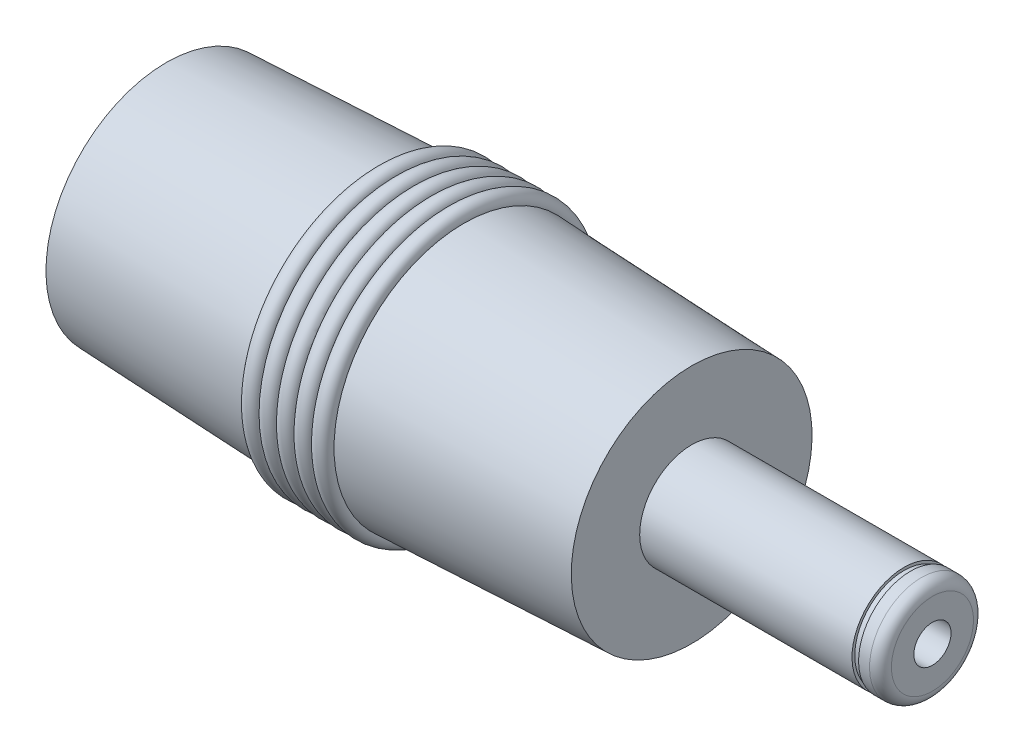
ISO-10303-21;
HEADER;
FILE_DESCRIPTION(('STEP AP214'),'2;1');
FILE_NAME('part.step','',(''),(''),'','','');
FILE_SCHEMA(('AUTOMOTIVE_DESIGN { 1 0 10303 214 1 1 1 1 }'));
ENDSEC;
DATA;
#1=APPLICATION_CONTEXT('core data for automotive mechanical design processes');
#2=APPLICATION_PROTOCOL_DEFINITION('international standard','automotive_design',2000,#1);
#3=PRODUCT_CONTEXT('',#1,'mechanical');
#4=PRODUCT('Part','Part','',(#3));
#5=PRODUCT_RELATED_PRODUCT_CATEGORY('part','',(#4));
#6=PRODUCT_DEFINITION_FORMATION('','',#4);
#7=PRODUCT_DEFINITION_CONTEXT('part definition',#1,'design');
#8=PRODUCT_DEFINITION('design','',#6,#7);
#9=PRODUCT_DEFINITION_SHAPE('','',#8);
#10=(LENGTH_UNIT() NAMED_UNIT(*) SI_UNIT(.MILLI.,.METRE.));
#11=(NAMED_UNIT(*) PLANE_ANGLE_UNIT() SI_UNIT($,.RADIAN.));
#12=(NAMED_UNIT(*) SI_UNIT($,.STERADIAN.) SOLID_ANGLE_UNIT());
#13=UNCERTAINTY_MEASURE_WITH_UNIT(LENGTH_MEASURE(1.E-05),#10,'distance_accuracy_value','');
#14=(GEOMETRIC_REPRESENTATION_CONTEXT(3) GLOBAL_UNCERTAINTY_ASSIGNED_CONTEXT((#13)) GLOBAL_UNIT_ASSIGNED_CONTEXT((#10,
#11,#12)) REPRESENTATION_CONTEXT('',''));
#15=CARTESIAN_POINT('',(0.,0.,0.));
#16=DIRECTION('',(0.,0.,1.));
#17=DIRECTION('',(1.,0.,0.));
#18=AXIS2_PLACEMENT_3D('',#15,#16,#17);
#19=CARTESIAN_POINT('',(28.825,0.,0.));
#20=DIRECTION('',(-1.,0.,0.));
#21=DIRECTION('',(0.,1.,0.));
#22=AXIS2_PLACEMENT_3D('',#19,#20,#21);
#23=CYLINDRICAL_SURFACE('',#22,2.375);
#24=CARTESIAN_POINT('',(24.,0.,0.));
#25=DIRECTION('',(-1.,0.,0.));
#26=DIRECTION('',(0.,1.,0.));
#27=AXIS2_PLACEMENT_3D('',#24,#25,#26);
#28=CIRCLE('',#27,2.375);
#29=CARTESIAN_POINT('',(24.,-2.375,0.));
#30=VERTEX_POINT('',#29);
#31=EDGE_CURVE('E24',#30,#30,#28,.T.);
#32=ORIENTED_EDGE('',*,*,#31,.F.);
#33=EDGE_LOOP('',(#32));
#34=FACE_BOUND('',#33,.T.);
#35=CARTESIAN_POINT('',(33.7,0.,0.));
#36=DIRECTION('',(1.,0.,0.));
#37=DIRECTION('',(0.,1.,0.));
#38=AXIS2_PLACEMENT_3D('',#35,#36,#37);
#39=CIRCLE('',#38,2.375);
#40=CARTESIAN_POINT('',(33.7,2.375,0.));
#41=VERTEX_POINT('',#40);
#42=EDGE_CURVE('E11',#41,#41,#39,.T.);
#43=ORIENTED_EDGE('',*,*,#42,.F.);
#44=EDGE_LOOP('',(#43));
#45=FACE_BOUND('',#44,.T.);
#46=ADVANCED_FACE('F17',(#34,#45),#23,.T.);
#47=CARTESIAN_POINT('',(33.7,2.3125,0.));
#48=DIRECTION('',(1.,0.,0.));
#49=DIRECTION('',(0.,1.,0.));
#50=AXIS2_PLACEMENT_3D('',#47,#48,#49);
#51=PLANE('',#50);
#52=ORIENTED_EDGE('',*,*,#42,.T.);
#53=EDGE_LOOP('',(#52));
#54=FACE_BOUND('',#53,.T.);
#55=CARTESIAN_POINT('',(33.7,0.,0.));
#56=DIRECTION('',(1.,0.,0.));
#57=DIRECTION('',(0.,1.,0.));
#58=AXIS2_PLACEMENT_3D('',#55,#56,#57);
#59=CIRCLE('',#58,2.25);
#60=CARTESIAN_POINT('',(33.7,2.25,0.));
#61=VERTEX_POINT('',#60);
#62=EDGE_CURVE('E176',#61,#61,#59,.T.);
#63=ORIENTED_EDGE('',*,*,#62,.F.);
#64=EDGE_LOOP('',(#63));
#65=FACE_BOUND('',#64,.T.);
#66=ADVANCED_FACE('F184',(#54,#65),#51,.T.);
#67=CARTESIAN_POINT('',(24.,2.75,0.));
#68=DIRECTION('',(1.,0.,0.));
#69=DIRECTION('',(0.,1.,0.));
#70=AXIS2_PLACEMENT_3D('',#67,#68,#69);
#71=PLANE('',#70);
#72=CARTESIAN_POINT('',(24.,0.,0.));
#73=DIRECTION('',(1.,0.,0.));
#74=DIRECTION('',(0.,1.,0.));
#75=AXIS2_PLACEMENT_3D('',#72,#73,#74);
#76=CIRCLE('',#75,5.5);
#77=CARTESIAN_POINT('',(24.,5.5,0.));
#78=VERTEX_POINT('',#77);
#79=EDGE_CURVE('E180',#78,#78,#76,.T.);
#80=ORIENTED_EDGE('',*,*,#79,.T.);
#81=EDGE_LOOP('',(#80));
#82=FACE_BOUND('',#81,.T.);
#83=ORIENTED_EDGE('',*,*,#31,.T.);
#84=EDGE_LOOP('',(#83));
#85=FACE_BOUND('',#84,.T.);
#86=ADVANCED_FACE('F190',(#82,#85),#71,.T.);
#87=CARTESIAN_POINT('',(33.875,0.,0.));
#88=DIRECTION('',(-1.,0.,0.));
#89=DIRECTION('',(0.,1.,0.));
#90=AXIS2_PLACEMENT_3D('',#87,#88,#89);
#91=CYLINDRICAL_SURFACE('',#90,2.25);
#92=ORIENTED_EDGE('',*,*,#62,.T.);
#93=EDGE_LOOP('',(#92));
#94=FACE_BOUND('',#93,.T.);
#95=CARTESIAN_POINT('',(34.,0.,0.));
#96=DIRECTION('',(-1.,0.,0.));
#97=DIRECTION('',(0.,1.,0.));
#98=AXIS2_PLACEMENT_3D('',#95,#96,#97);
#99=CIRCLE('',#98,2.25);
#100=CARTESIAN_POINT('',(34.,-2.25,0.));
#101=VERTEX_POINT('',#100);
#102=EDGE_CURVE('E175',#101,#101,#99,.T.);
#103=ORIENTED_EDGE('',*,*,#102,.T.);
#104=EDGE_LOOP('',(#103));
#105=FACE_BOUND('',#104,.T.);
#106=ADVANCED_FACE('F181',(#94,#105),#91,.T.);
#107=CARTESIAN_POINT('',(18.,0.,0.));
#108=DIRECTION('',(-1.,0.,0.));
#109=DIRECTION('',(0.,1.,0.));
#110=AXIS2_PLACEMENT_3D('',#107,#108,#109);
#111=CONICAL_SURFACE('',#110,5.75,0.0416425790985869);
#112=ORIENTED_EDGE('',*,*,#79,.F.);
#113=EDGE_LOOP('',(#112));
#114=FACE_BOUND('',#113,.T.);
#115=CARTESIAN_POINT('',(13.5944443769948,0.,0.));
#116=DIRECTION('',(1.,0.,0.));
#117=DIRECTION('',(0.,1.,0.));
#118=AXIS2_PLACEMENT_3D('',#115,#116,#117);
#119=CIRCLE('',#118,5.93356481762522);
#120=CARTESIAN_POINT('',(13.5944443769948,-5.93356481762522,0.));
#121=VERTEX_POINT('',#120);
#122=EDGE_CURVE('E158',#121,#121,#119,.T.);
#123=ORIENTED_EDGE('',*,*,#122,.T.);
#124=EDGE_LOOP('',(#123));
#125=FACE_BOUND('',#124,.T.);
#126=ADVANCED_FACE('F200',(#114,#125),#111,.T.);
#127=CARTESIAN_POINT('',(34.,1.1875,0.));
#128=DIRECTION('',(-1.,0.,0.));
#129=DIRECTION('',(0.,-1.,0.));
#130=AXIS2_PLACEMENT_3D('',#127,#128,#129);
#131=PLANE('',#130);
#132=ORIENTED_EDGE('',*,*,#102,.F.);
#133=EDGE_LOOP('',(#132));
#134=FACE_BOUND('',#133,.T.);
#135=CARTESIAN_POINT('',(34.,0.,0.));
#136=DIRECTION('',(1.,0.,0.));
#137=DIRECTION('',(0.,1.,0.));
#138=AXIS2_PLACEMENT_3D('',#135,#136,#137);
#139=CIRCLE('',#138,2.375);
#140=CARTESIAN_POINT('',(34.,2.375,0.));
#141=VERTEX_POINT('',#140);
#142=EDGE_CURVE('E156',#141,#141,#139,.T.);
#143=ORIENTED_EDGE('',*,*,#142,.F.);
#144=EDGE_LOOP('',(#143));
#145=FACE_BOUND('',#144,.T.);
#146=ADVANCED_FACE('F205',(#134,#145),#131,.T.);
#147=CARTESIAN_POINT('',(13.2,0.,0.));
#148=DIRECTION('',(1.,0.,0.));
#149=DIRECTION('',(0.,0.,-1.));
#150=AXIS2_PLACEMENT_3D('',#147,#148,#149);
#151=TOROIDAL_SURFACE('',#150,6.,0.4);
#152=ORIENTED_EDGE('',*,*,#122,.F.);
#153=EDGE_LOOP('',(#152));
#154=FACE_BOUND('',#153,.T.);
#155=CARTESIAN_POINT('',(12.8,0.,0.));
#156=DIRECTION('',(1.,0.,0.));
#157=DIRECTION('',(0.,0.,-1.));
#158=AXIS2_PLACEMENT_3D('',#155,#156,#157);
#159=CIRCLE('',#158,6.);
#160=CARTESIAN_POINT('',(12.8,0.,6.));
#161=VERTEX_POINT('',#160);
#162=EDGE_CURVE('E133',#161,#161,#159,.T.);
#163=ORIENTED_EDGE('',*,*,#162,.T.);
#164=EDGE_LOOP('',(#163));
#165=FACE_BOUND('',#164,.T.);
#166=ADVANCED_FACE('F204',(#154,#165),#151,.T.);
#167=CARTESIAN_POINT('',(34.25,0.,0.));
#168=DIRECTION('',(-1.,0.,0.));
#169=DIRECTION('',(0.,1.,0.));
#170=AXIS2_PLACEMENT_3D('',#167,#168,#169);
#171=CYLINDRICAL_SURFACE('',#170,2.375);
#172=ORIENTED_EDGE('',*,*,#142,.T.);
#173=EDGE_LOOP('',(#172));
#174=FACE_BOUND('',#173,.T.);
#175=CARTESIAN_POINT('',(34.5,0.,0.));
#176=DIRECTION('',(1.,0.,0.));
#177=DIRECTION('',(0.,1.,0.));
#178=AXIS2_PLACEMENT_3D('',#175,#176,#177);
#179=CIRCLE('',#178,2.375);
#180=CARTESIAN_POINT('',(34.5,2.375,0.));
#181=VERTEX_POINT('',#180);
#182=EDGE_CURVE('E135',#181,#181,#179,.T.);
#183=ORIENTED_EDGE('',*,*,#182,.F.);
#184=EDGE_LOOP('',(#183));
#185=FACE_BOUND('',#184,.T.);
#186=ADVANCED_FACE('F210',(#174,#185),#171,.T.);
#187=CARTESIAN_POINT('',(13.2,0.,0.));
#188=DIRECTION('',(1.,0.,0.));
#189=DIRECTION('',(0.,0.,-1.));
#190=AXIS2_PLACEMENT_3D('',#187,#188,#189);
#191=TOROIDAL_SURFACE('',#190,6.,0.4);
#192=ORIENTED_EDGE('',*,*,#162,.F.);
#193=EDGE_LOOP('',(#192));
#194=FACE_BOUND('',#193,.T.);
#195=CARTESIAN_POINT('',(12.8013961775979,0.,0.));
#196=DIRECTION('',(-1.,0.,0.));
#197=DIRECTION('',(0.,1.,0.));
#198=AXIS2_PLACEMENT_3D('',#195,#196,#197);
#199=CIRCLE('',#198,5.96660849260009);
#200=CARTESIAN_POINT('',(12.8013961775979,-5.96660849260009,0.));
#201=VERTEX_POINT('',#200);
#202=EDGE_CURVE('E134',#201,#201,#199,.T.);
#203=ORIENTED_EDGE('',*,*,#202,.F.);
#204=EDGE_LOOP('',(#203));
#205=FACE_BOUND('',#204,.T.);
#206=ADVANCED_FACE('F207',(#194,#205),#191,.T.);
#207=CARTESIAN_POINT('',(34.5,0.,0.));
#208=DIRECTION('',(1.,0.,0.));
#209=DIRECTION('',(0.,0.,-1.));
#210=AXIS2_PLACEMENT_3D('',#207,#208,#209);
#211=TOROIDAL_SURFACE('',#210,1.875,0.5);
#212=ORIENTED_EDGE('',*,*,#182,.T.);
#213=EDGE_LOOP('',(#212));
#214=FACE_BOUND('',#213,.T.);
#215=CARTESIAN_POINT('',(35.,0.,0.));
#216=DIRECTION('',(1.,0.,0.));
#217=DIRECTION('',(0.,1.,0.));
#218=AXIS2_PLACEMENT_3D('',#215,#216,#217);
#219=CIRCLE('',#218,1.875);
#220=CARTESIAN_POINT('',(35.,1.875,0.));
#221=VERTEX_POINT('',#220);
#222=EDGE_CURVE('E168',#221,#221,#219,.T.);
#223=ORIENTED_EDGE('',*,*,#222,.F.);
#224=EDGE_LOOP('',(#223));
#225=FACE_BOUND('',#224,.T.);
#226=ADVANCED_FACE('F215',(#214,#225),#211,.T.);
#227=CARTESIAN_POINT('',(18.,0.,0.));
#228=DIRECTION('',(-1.,0.,0.));
#229=DIRECTION('',(0.,1.,0.));
#230=AXIS2_PLACEMENT_3D('',#227,#228,#229);
#231=CONICAL_SURFACE('',#230,5.75,0.0416425790985869);
#232=CARTESIAN_POINT('',(12.7986135181976,0.,0.));
#233=DIRECTION('',(1.,0.,0.));
#234=DIRECTION('',(0.,1.,0.));
#235=AXIS2_PLACEMENT_3D('',#232,#233,#234);
#236=CIRCLE('',#235,5.96672443674177);
#237=CARTESIAN_POINT('',(12.7986135181976,-5.96672443674177,0.));
#238=VERTEX_POINT('',#237);
#239=EDGE_CURVE('E169',#238,#238,#236,.T.);
#240=ORIENTED_EDGE('',*,*,#239,.T.);
#241=EDGE_LOOP('',(#240));
#242=FACE_BOUND('',#241,.T.);
#243=ORIENTED_EDGE('',*,*,#202,.T.);
#244=EDGE_LOOP('',(#243));
#245=FACE_BOUND('',#244,.T.);
#246=ADVANCED_FACE('F216',(#242,#245),#231,.T.);
#247=CARTESIAN_POINT('',(35.,0.9375,0.));
#248=DIRECTION('',(1.,0.,0.));
#249=DIRECTION('',(0.,1.,0.));
#250=AXIS2_PLACEMENT_3D('',#247,#248,#249);
#251=PLANE('',#250);
#252=ORIENTED_EDGE('',*,*,#222,.T.);
#253=EDGE_LOOP('',(#252));
#254=FACE_BOUND('',#253,.T.);
#255=CARTESIAN_POINT('',(35.,0.,0.));
#256=DIRECTION('',(-1.,0.,0.));
#257=DIRECTION('',(0.,0.,-1.));
#258=AXIS2_PLACEMENT_3D('',#255,#256,#257);
#259=CIRCLE('',#258,0.85);
#260=CARTESIAN_POINT('',(35.,0.,0.85));
#261=VERTEX_POINT('',#260);
#262=EDGE_CURVE('E167',#261,#261,#259,.T.);
#263=ORIENTED_EDGE('',*,*,#262,.T.);
#264=EDGE_LOOP('',(#263));
#265=FACE_BOUND('',#264,.T.);
#266=ADVANCED_FACE('F219',(#254,#265),#251,.T.);
#267=CARTESIAN_POINT('',(12.4,0.,0.));
#268=DIRECTION('',(1.,0.,0.));
#269=DIRECTION('',(0.,0.,-1.));
#270=AXIS2_PLACEMENT_3D('',#267,#268,#269);
#271=TOROIDAL_SURFACE('',#270,6.,0.4);
#272=ORIENTED_EDGE('',*,*,#239,.F.);
#273=EDGE_LOOP('',(#272));
#274=FACE_BOUND('',#273,.T.);
#275=CARTESIAN_POINT('',(12.8,0.,0.));
#276=DIRECTION('',(1.,0.,0.));
#277=DIRECTION('',(0.,0.,-1.));
#278=AXIS2_PLACEMENT_3D('',#275,#276,#277);
#279=CIRCLE('',#278,6.);
#280=CARTESIAN_POINT('',(12.8,0.,6.));
#281=VERTEX_POINT('',#280);
#282=EDGE_CURVE('E163',#281,#281,#279,.T.);
#283=ORIENTED_EDGE('',*,*,#282,.T.);
#284=EDGE_LOOP('',(#283));
#285=FACE_BOUND('',#284,.T.);
#286=ADVANCED_FACE('F225',(#274,#285),#271,.T.);
#287=CARTESIAN_POINT('',(30.,0.,0.));
#288=DIRECTION('',(-1.,0.,0.));
#289=DIRECTION('',(0.,0.,-1.));
#290=AXIS2_PLACEMENT_3D('',#287,#288,#289);
#291=CYLINDRICAL_SURFACE('',#290,0.85);
#292=CARTESIAN_POINT('',(24.,0.,0.));
#293=DIRECTION('',(1.,0.,0.));
#294=DIRECTION('',(0.,0.,-1.));
#295=AXIS2_PLACEMENT_3D('',#292,#293,#294);
#296=CIRCLE('',#295,0.85);
#297=CARTESIAN_POINT('',(24.,0.,-0.85));
#298=VERTEX_POINT('',#297);
#299=EDGE_CURVE('E129',#298,#298,#296,.T.);
#300=ORIENTED_EDGE('',*,*,#299,.F.);
#301=EDGE_LOOP('',(#300));
#302=FACE_BOUND('',#301,.T.);
#303=ORIENTED_EDGE('',*,*,#262,.F.);
#304=EDGE_LOOP('',(#303));
#305=FACE_BOUND('',#304,.T.);
#306=ADVANCED_FACE('F223',(#302,#305),#291,.F.);
#307=CARTESIAN_POINT('',(12.4,0.,0.));
#308=DIRECTION('',(1.,0.,0.));
#309=DIRECTION('',(0.,0.,-1.));
#310=AXIS2_PLACEMENT_3D('',#307,#308,#309);
#311=TOROIDAL_SURFACE('',#310,6.,0.4);
#312=ORIENTED_EDGE('',*,*,#282,.F.);
#313=EDGE_LOOP('',(#312));
#314=FACE_BOUND('',#313,.T.);
#315=CARTESIAN_POINT('',(12.,0.,0.));
#316=DIRECTION('',(1.,0.,0.));
#317=DIRECTION('',(0.,1.,0.));
#318=AXIS2_PLACEMENT_3D('',#315,#316,#317);
#319=CIRCLE('',#318,6.);
#320=CARTESIAN_POINT('',(12.,6.,0.));
#321=VERTEX_POINT('',#320);
#322=EDGE_CURVE('E128',#321,#321,#319,.T.);
#323=ORIENTED_EDGE('',*,*,#322,.T.);
#324=EDGE_LOOP('',(#323));
#325=FACE_BOUND('',#324,.T.);
#326=ADVANCED_FACE('F228',(#314,#325),#311,.T.);
#327=CARTESIAN_POINT('',(24.,2.75,0.));
#328=DIRECTION('',(1.,0.,0.));
#329=DIRECTION('',(0.,1.,0.));
#330=AXIS2_PLACEMENT_3D('',#327,#328,#329);
#331=PLANE('',#330);
#332=ORIENTED_EDGE('',*,*,#299,.T.);
#333=EDGE_LOOP('',(#332));
#334=FACE_BOUND('',#333,.T.);
#335=ADVANCED_FACE('F234',(#334),#331,.T.);
#336=CARTESIAN_POINT('',(11.6,0.,0.));
#337=DIRECTION('',(1.,0.,0.));
#338=DIRECTION('',(0.,0.,-1.));
#339=AXIS2_PLACEMENT_3D('',#336,#337,#338);
#340=TOROIDAL_SURFACE('',#339,6.,0.4);
#341=ORIENTED_EDGE('',*,*,#322,.F.);
#342=EDGE_LOOP('',(#341));
#343=FACE_BOUND('',#342,.T.);
#344=CARTESIAN_POINT('',(11.2,0.,0.));
#345=DIRECTION('',(1.,0.,0.));
#346=DIRECTION('',(0.,0.,-1.));
#347=AXIS2_PLACEMENT_3D('',#344,#345,#346);
#348=CIRCLE('',#347,6.);
#349=CARTESIAN_POINT('',(11.2,0.,6.));
#350=VERTEX_POINT('',#349);
#351=EDGE_CURVE('E131',#350,#350,#348,.T.);
#352=ORIENTED_EDGE('',*,*,#351,.T.);
#353=EDGE_LOOP('',(#352));
#354=FACE_BOUND('',#353,.T.);
#355=ADVANCED_FACE('F236',(#343,#354),#340,.T.);
#356=CARTESIAN_POINT('',(11.6,0.,0.));
#357=DIRECTION('',(1.,0.,0.));
#358=DIRECTION('',(0.,0.,-1.));
#359=AXIS2_PLACEMENT_3D('',#356,#357,#358);
#360=TOROIDAL_SURFACE('',#359,6.,0.4);
#361=ORIENTED_EDGE('',*,*,#351,.F.);
#362=EDGE_LOOP('',(#361));
#363=FACE_BOUND('',#362,.T.);
#364=CARTESIAN_POINT('',(11.2013864818024,0.,0.));
#365=DIRECTION('',(-1.,0.,0.));
#366=DIRECTION('',(0.,1.,0.));
#367=AXIS2_PLACEMENT_3D('',#364,#365,#366);
#368=CIRCLE('',#367,5.96672443674177);
#369=CARTESIAN_POINT('',(11.2013864818024,-5.96672443674177,0.));
#370=VERTEX_POINT('',#369);
#371=EDGE_CURVE('E145',#370,#370,#368,.T.);
#372=ORIENTED_EDGE('',*,*,#371,.F.);
#373=EDGE_LOOP('',(#372));
#374=FACE_BOUND('',#373,.T.);
#375=ADVANCED_FACE('F237',(#363,#374),#360,.T.);
#376=CARTESIAN_POINT('',(6.,0.,0.));
#377=DIRECTION('',(1.,0.,0.));
#378=DIRECTION('',(0.,1.,0.));
#379=AXIS2_PLACEMENT_3D('',#376,#377,#378);
#380=CONICAL_SURFACE('',#379,5.75,0.0416425790985869);
#381=CARTESIAN_POINT('',(11.1986038224021,0.,0.));
#382=DIRECTION('',(1.,0.,0.));
#383=DIRECTION('',(0.,1.,0.));
#384=AXIS2_PLACEMENT_3D('',#381,#382,#383);
#385=CIRCLE('',#384,5.96660849260009);
#386=CARTESIAN_POINT('',(11.1986038224021,-5.96660849260009,0.));
#387=VERTEX_POINT('',#386);
#388=EDGE_CURVE('E142',#387,#387,#385,.T.);
#389=ORIENTED_EDGE('',*,*,#388,.T.);
#390=EDGE_LOOP('',(#389));
#391=FACE_BOUND('',#390,.T.);
#392=ORIENTED_EDGE('',*,*,#371,.T.);
#393=EDGE_LOOP('',(#392));
#394=FACE_BOUND('',#393,.T.);
#395=ADVANCED_FACE('F245',(#391,#394),#380,.T.);
#396=CARTESIAN_POINT('',(10.8,0.,0.));
#397=DIRECTION('',(1.,0.,0.));
#398=DIRECTION('',(0.,0.,-1.));
#399=AXIS2_PLACEMENT_3D('',#396,#397,#398);
#400=TOROIDAL_SURFACE('',#399,6.,0.4);
#401=ORIENTED_EDGE('',*,*,#388,.F.);
#402=EDGE_LOOP('',(#401));
#403=FACE_BOUND('',#402,.T.);
#404=CARTESIAN_POINT('',(11.2,0.,0.));
#405=DIRECTION('',(1.,0.,0.));
#406=DIRECTION('',(0.,0.,-1.));
#407=AXIS2_PLACEMENT_3D('',#404,#405,#406);
#408=CIRCLE('',#407,6.);
#409=CARTESIAN_POINT('',(11.2,0.,6.));
#410=VERTEX_POINT('',#409);
#411=EDGE_CURVE('E144',#410,#410,#408,.T.);
#412=ORIENTED_EDGE('',*,*,#411,.T.);
#413=EDGE_LOOP('',(#412));
#414=FACE_BOUND('',#413,.T.);
#415=ADVANCED_FACE('F249',(#403,#414),#400,.T.);
#416=CARTESIAN_POINT('',(10.8,0.,0.));
#417=DIRECTION('',(1.,0.,0.));
#418=DIRECTION('',(0.,0.,-1.));
#419=AXIS2_PLACEMENT_3D('',#416,#417,#418);
#420=TOROIDAL_SURFACE('',#419,6.,0.4);
#421=ORIENTED_EDGE('',*,*,#411,.F.);
#422=EDGE_LOOP('',(#421));
#423=FACE_BOUND('',#422,.T.);
#424=CARTESIAN_POINT('',(10.4,0.,0.));
#425=DIRECTION('',(1.,0.,0.));
#426=DIRECTION('',(0.,0.,-1.));
#427=AXIS2_PLACEMENT_3D('',#424,#425,#426);
#428=CIRCLE('',#427,6.);
#429=CARTESIAN_POINT('',(10.4,0.,6.));
#430=VERTEX_POINT('',#429);
#431=EDGE_CURVE('E147',#430,#430,#428,.T.);
#432=ORIENTED_EDGE('',*,*,#431,.T.);
#433=EDGE_LOOP('',(#432));
#434=FACE_BOUND('',#433,.T.);
#435=ADVANCED_FACE('F243',(#423,#434),#420,.T.);
#436=CARTESIAN_POINT('',(10.8,0.,0.));
#437=DIRECTION('',(1.,0.,0.));
#438=DIRECTION('',(0.,0.,-1.));
#439=AXIS2_PLACEMENT_3D('',#436,#437,#438);
#440=TOROIDAL_SURFACE('',#439,6.,0.4);
#441=ORIENTED_EDGE('',*,*,#431,.F.);
#442=EDGE_LOOP('',(#441));
#443=FACE_BOUND('',#442,.T.);
#444=CARTESIAN_POINT('',(10.4055556230052,0.,0.));
#445=DIRECTION('',(-1.,0.,0.));
#446=DIRECTION('',(0.,1.,0.));
#447=AXIS2_PLACEMENT_3D('',#444,#445,#446);
#448=CIRCLE('',#447,5.93356481762522);
#449=CARTESIAN_POINT('',(10.4055556230052,-5.93356481762522,0.));
#450=VERTEX_POINT('',#449);
#451=EDGE_CURVE('E146',#450,#450,#448,.T.);
#452=ORIENTED_EDGE('',*,*,#451,.F.);
#453=EDGE_LOOP('',(#452));
#454=FACE_BOUND('',#453,.T.);
#455=ADVANCED_FACE('F250',(#443,#454),#440,.T.);
#456=CARTESIAN_POINT('',(6.,0.,0.));
#457=DIRECTION('',(1.,0.,0.));
#458=DIRECTION('',(0.,1.,0.));
#459=AXIS2_PLACEMENT_3D('',#456,#457,#458);
#460=CONICAL_SURFACE('',#459,5.75,0.0416425790985869);
#461=CARTESIAN_POINT('',(10.3943655639339,0.,0.));
#462=DIRECTION('',(1.,0.,0.));
#463=DIRECTION('',(0.,1.,0.));
#464=AXIS2_PLACEMENT_3D('',#461,#462,#463);
#465=CIRCLE('',#464,5.93309856516391);
#466=CARTESIAN_POINT('',(10.3943655639339,-5.93309856516391,0.));
#467=VERTEX_POINT('',#466);
#468=EDGE_CURVE('E151',#467,#467,#465,.T.);
#469=ORIENTED_EDGE('',*,*,#468,.T.);
#470=EDGE_LOOP('',(#469));
#471=FACE_BOUND('',#470,.T.);
#472=ORIENTED_EDGE('',*,*,#451,.T.);
#473=EDGE_LOOP('',(#472));
#474=FACE_BOUND('',#473,.T.);
#475=ADVANCED_FACE('F248',(#471,#474),#460,.T.);
#476=CARTESIAN_POINT('',(10.,0.,0.));
#477=DIRECTION('',(1.,0.,0.));
#478=DIRECTION('',(0.,0.,-1.));
#479=AXIS2_PLACEMENT_3D('',#476,#477,#478);
#480=TOROIDAL_SURFACE('',#479,6.,0.4);
#481=ORIENTED_EDGE('',*,*,#468,.F.);
#482=EDGE_LOOP('',(#481));
#483=FACE_BOUND('',#482,.T.);
#484=CARTESIAN_POINT('',(10.4,0.,0.));
#485=DIRECTION('',(1.,0.,0.));
#486=DIRECTION('',(0.,0.,-1.));
#487=AXIS2_PLACEMENT_3D('',#484,#485,#486);
#488=CIRCLE('',#487,6.);
#489=CARTESIAN_POINT('',(10.4,0.,6.));
#490=VERTEX_POINT('',#489);
#491=EDGE_CURVE('E153',#490,#490,#488,.T.);
#492=ORIENTED_EDGE('',*,*,#491,.T.);
#493=EDGE_LOOP('',(#492));
#494=FACE_BOUND('',#493,.T.);
#495=ADVANCED_FACE('F251',(#483,#494),#480,.T.);
#496=CARTESIAN_POINT('',(10.,0.,0.));
#497=DIRECTION('',(1.,0.,0.));
#498=DIRECTION('',(0.,0.,-1.));
#499=AXIS2_PLACEMENT_3D('',#496,#497,#498);
#500=TOROIDAL_SURFACE('',#499,6.,0.4);
#501=ORIENTED_EDGE('',*,*,#491,.F.);
#502=EDGE_LOOP('',(#501));
#503=FACE_BOUND('',#502,.T.);
#504=CARTESIAN_POINT('',(9.61256684507827,0.,0.));
#505=DIRECTION('',(-1.,0.,0.));
#506=DIRECTION('',(0.,1.,0.));
#507=AXIS2_PLACEMENT_3D('',#504,#505,#506);
#508=CIRCLE('',#507,5.90052361854493);
#509=CARTESIAN_POINT('',(9.61256684507827,-5.90052361854493,0.));
#510=VERTEX_POINT('',#509);
#511=EDGE_CURVE('E150',#510,#510,#508,.T.);
#512=ORIENTED_EDGE('',*,*,#511,.F.);
#513=EDGE_LOOP('',(#512));
#514=FACE_BOUND('',#513,.T.);
#515=ADVANCED_FACE('F260',(#503,#514),#500,.T.);
#516=CARTESIAN_POINT('',(6.,0.,0.));
#517=DIRECTION('',(1.,0.,0.));
#518=DIRECTION('',(0.,1.,0.));
#519=AXIS2_PLACEMENT_3D('',#516,#517,#518);
#520=CONICAL_SURFACE('',#519,5.75,0.0416425790985869);
#521=CARTESIAN_POINT('',(0.,0.,0.));
#522=DIRECTION('',(1.,0.,0.));
#523=DIRECTION('',(0.,1.,0.));
#524=AXIS2_PLACEMENT_3D('',#521,#522,#523);
#525=CIRCLE('',#524,5.5);
#526=CARTESIAN_POINT('',(0.,5.5,0.));
#527=VERTEX_POINT('',#526);
#528=EDGE_CURVE('E143',#527,#527,#525,.T.);
#529=ORIENTED_EDGE('',*,*,#528,.T.);
#530=EDGE_LOOP('',(#529));
#531=FACE_BOUND('',#530,.T.);
#532=ORIENTED_EDGE('',*,*,#511,.T.);
#533=EDGE_LOOP('',(#532));
#534=FACE_BOUND('',#533,.T.);
#535=ADVANCED_FACE('F265',(#531,#534),#520,.T.);
#536=CARTESIAN_POINT('',(0.,2.75,0.));
#537=DIRECTION('',(-1.,0.,0.));
#538=DIRECTION('',(0.,-1.,0.));
#539=AXIS2_PLACEMENT_3D('',#536,#537,#538);
#540=PLANE('',#539);
#541=ORIENTED_EDGE('',*,*,#528,.F.);
#542=EDGE_LOOP('',(#541));
#543=FACE_BOUND('',#542,.T.);
#544=CARTESIAN_POINT('',(0.,0.,0.));
#545=DIRECTION('',(1.,0.,0.));
#546=DIRECTION('',(0.,0.,1.));
#547=AXIS2_PLACEMENT_3D('',#544,#545,#546);
#548=CIRCLE('',#547,3.25);
#549=CARTESIAN_POINT('',(0.,0.,-3.25));
#550=VERTEX_POINT('',#549);
#551=EDGE_CURVE('E136',#550,#550,#548,.T.);
#552=ORIENTED_EDGE('',*,*,#551,.T.);
#553=EDGE_LOOP('',(#552));
#554=FACE_BOUND('',#553,.T.);
#555=ADVANCED_FACE('F264',(#543,#554),#540,.T.);
#556=CARTESIAN_POINT('',(0.,0.,0.));
#557=DIRECTION('',(1.,0.,0.));
#558=DIRECTION('',(0.,0.,-1.));
#559=AXIS2_PLACEMENT_3D('',#556,#557,#558);
#560=TOROIDAL_SURFACE('',#559,3.,0.25);
#561=ORIENTED_EDGE('',*,*,#551,.F.);
#562=EDGE_LOOP('',(#561));
#563=FACE_BOUND('',#562,.T.);
#564=CARTESIAN_POINT('',(0.,0.,0.));
#565=DIRECTION('',(1.,0.,0.));
#566=DIRECTION('',(0.,0.,-1.));
#567=AXIS2_PLACEMENT_3D('',#564,#565,#566);
#568=CIRCLE('',#567,2.75);
#569=CARTESIAN_POINT('',(0.,0.,2.75));
#570=VERTEX_POINT('',#569);
#571=EDGE_CURVE('E140',#570,#570,#568,.T.);
#572=ORIENTED_EDGE('',*,*,#571,.T.);
#573=EDGE_LOOP('',(#572));
#574=FACE_BOUND('',#573,.T.);
#575=ADVANCED_FACE('F275',(#563,#574),#560,.T.);
#576=CARTESIAN_POINT('',(5.,0.,0.));
#577=DIRECTION('',(-1.,0.,0.));
#578=DIRECTION('',(0.,0.,-1.));
#579=AXIS2_PLACEMENT_3D('',#576,#577,#578);
#580=CYLINDRICAL_SURFACE('',#579,2.75);
#581=CARTESIAN_POINT('',(11.,0.,0.));
#582=DIRECTION('',(1.,0.,0.));
#583=DIRECTION('',(0.,0.,-1.));
#584=AXIS2_PLACEMENT_3D('',#581,#582,#583);
#585=CIRCLE('',#584,2.75);
#586=CARTESIAN_POINT('',(11.,0.,-2.75));
#587=VERTEX_POINT('',#586);
#588=EDGE_CURVE('E123',#587,#587,#585,.T.);
#589=ORIENTED_EDGE('',*,*,#588,.T.);
#590=EDGE_LOOP('',(#589));
#591=FACE_BOUND('',#590,.T.);
#592=ORIENTED_EDGE('',*,*,#571,.F.);
#593=EDGE_LOOP('',(#592));
#594=FACE_BOUND('',#593,.T.);
#595=ADVANCED_FACE('F276',(#591,#594),#580,.F.);
#596=CARTESIAN_POINT('',(11.,0.,0.));
#597=DIRECTION('',(1.,0.,0.));
#598=DIRECTION('',(0.,0.,-1.));
#599=AXIS2_PLACEMENT_3D('',#596,#597,#598);
#600=PLANE('',#599);
#601=ORIENTED_EDGE('',*,*,#588,.F.);
#602=EDGE_LOOP('',(#601));
#603=FACE_BOUND('',#602,.T.);
#604=CARTESIAN_POINT('',(11.,0.,0.));
#605=DIRECTION('',(1.,0.,0.));
#606=DIRECTION('',(0.,0.,-1.));
#607=AXIS2_PLACEMENT_3D('',#604,#605,#606);
#608=CIRCLE('',#607,1.05);
#609=CARTESIAN_POINT('',(11.,0.,1.05));
#610=VERTEX_POINT('',#609);
#611=EDGE_CURVE('E124',#610,#610,#608,.T.);
#612=ORIENTED_EDGE('',*,*,#611,.T.);
#613=EDGE_LOOP('',(#612));
#614=FACE_BOUND('',#613,.T.);
#615=ADVANCED_FACE('F286',(#603,#614),#600,.F.);
#616=CARTESIAN_POINT('',(6.275,0.,0.));
#617=DIRECTION('',(-1.,0.,0.));
#618=DIRECTION('',(0.,0.,-1.));
#619=AXIS2_PLACEMENT_3D('',#616,#617,#618);
#620=CYLINDRICAL_SURFACE('',#619,1.05);
#621=ORIENTED_EDGE('',*,*,#611,.F.);
#622=EDGE_LOOP('',(#621));
#623=FACE_BOUND('',#622,.T.);
#624=CARTESIAN_POINT('',(1.05,0.,0.));
#625=DIRECTION('',(-1.,0.,0.));
#626=DIRECTION('',(0.,0.,-1.));
#627=AXIS2_PLACEMENT_3D('',#624,#625,#626);
#628=CIRCLE('',#627,1.05);
#629=CARTESIAN_POINT('',(1.05,0.,-1.05));
#630=VERTEX_POINT('',#629);
#631=EDGE_CURVE('E120',#630,#630,#628,.T.);
#632=ORIENTED_EDGE('',*,*,#631,.F.);
#633=EDGE_LOOP('',(#632));
#634=FACE_BOUND('',#633,.T.);
#635=ADVANCED_FACE('F293',(#623,#634),#620,.T.);
#636=CARTESIAN_POINT('',(1.05,0.,0.));
#637=DIRECTION('',(0.,0.,1.));
#638=DIRECTION('',(1.,0.,0.));
#639=AXIS2_PLACEMENT_3D('',#636,#637,#638);
#640=SPHERICAL_SURFACE('',#639,1.05);
#641=CARTESIAN_POINT('',(1.05,0.,0.));
#642=DIRECTION('',(-1.,0.,0.));
#643=DIRECTION('',(0.,0.,-1.));
#644=AXIS2_PLACEMENT_3D('',#641,#642,#643);
#645=SPHERICAL_SURFACE('',#644,1.05);
#646=ORIENTED_EDGE('',*,*,#631,.T.);
#647=EDGE_LOOP('',(#646));
#648=FACE_BOUND('',#647,.T.);
#649=ADVANCED_FACE('F122',(#648),#645,.T.);
#650=CLOSED_SHELL('',(#46,#66,#86,#106,#126,#146,#166,#186,#206,#226,#246,#266,#286,#306,#326,
#335,#355,#375,#395,#415,#435,#455,#475,#495,#515,#535,#555,#575,#595,#615,#635,#649));
#651=MANIFOLD_SOLID_BREP('B1',#650);
#652=ADVANCED_BREP_SHAPE_REPRESENTATION('',(#18,#651),#14);
#653=SHAPE_DEFINITION_REPRESENTATION(#9,#652);
ENDSEC;
END-ISO-10303-21;
